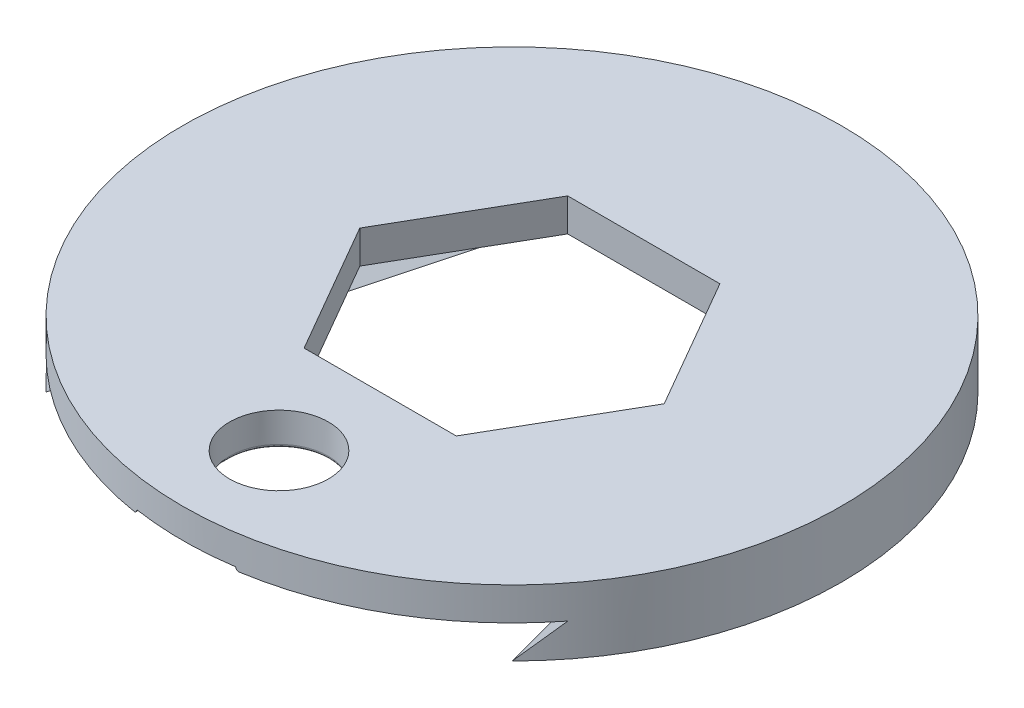
ISO-10303-21;
HEADER;
FILE_DESCRIPTION(('STEP AP214'),'2;1');
FILE_NAME('part.step','',(''),(''),'','','');
FILE_SCHEMA(('AUTOMOTIVE_DESIGN { 1 0 10303 214 1 1 1 1 }'));
ENDSEC;
DATA;
#1=APPLICATION_CONTEXT('core data for automotive mechanical design processes');
#2=APPLICATION_PROTOCOL_DEFINITION('international standard','automotive_design',2000,#1);
#3=PRODUCT_CONTEXT('',#1,'mechanical');
#4=PRODUCT('Part','Part','',(#3));
#5=PRODUCT_RELATED_PRODUCT_CATEGORY('part','',(#4));
#6=PRODUCT_DEFINITION_FORMATION('','',#4);
#7=PRODUCT_DEFINITION_CONTEXT('part definition',#1,'design');
#8=PRODUCT_DEFINITION('design','',#6,#7);
#9=PRODUCT_DEFINITION_SHAPE('','',#8);
#10=(LENGTH_UNIT() NAMED_UNIT(*) SI_UNIT(.MILLI.,.METRE.));
#11=(NAMED_UNIT(*) PLANE_ANGLE_UNIT() SI_UNIT($,.RADIAN.));
#12=(NAMED_UNIT(*) SI_UNIT($,.STERADIAN.) SOLID_ANGLE_UNIT());
#13=UNCERTAINTY_MEASURE_WITH_UNIT(LENGTH_MEASURE(1.E-05),#10,'distance_accuracy_value','');
#14=(GEOMETRIC_REPRESENTATION_CONTEXT(3) GLOBAL_UNCERTAINTY_ASSIGNED_CONTEXT((#13)) GLOBAL_UNIT_ASSIGNED_CONTEXT((#10,
#11,#12)) REPRESENTATION_CONTEXT('',''));
#15=CARTESIAN_POINT('',(0.,0.,0.));
#16=DIRECTION('',(0.,0.,1.));
#17=DIRECTION('',(1.,0.,0.));
#18=AXIS2_PLACEMENT_3D('',#15,#16,#17);
#19=CARTESIAN_POINT('',(0.,0.,0.));
#20=DIRECTION('',(0.,1.,0.));
#21=DIRECTION('',(0.,0.,1.));
#22=AXIS2_PLACEMENT_3D('',#19,#20,#21);
#23=PLANE('',#22);
#24=DIRECTION('',(-0.5,0.,0.866025403784439));
#25=VECTOR('',#24,1.);
#26=CARTESIAN_POINT('',(23.094010767585,0.,0.));
#27=LINE('',#26,#25);
#28=CARTESIAN_POINT('',(23.094010767585,0.,0.));
#29=VERTEX_POINT('',#28);
#30=CARTESIAN_POINT('',(11.5470053837925,0.,20.));
#31=VERTEX_POINT('',#30);
#32=EDGE_CURVE('E226',#29,#31,#27,.T.);
#33=ORIENTED_EDGE('',*,*,#32,.F.);
#34=DIRECTION('',(0.5,0.,0.866025403784439));
#35=VECTOR('',#34,1.);
#36=CARTESIAN_POINT('',(11.5470053837925,0.,-20.));
#37=LINE('',#36,#35);
#38=CARTESIAN_POINT('',(11.5470053837925,0.,-20.));
#39=VERTEX_POINT('',#38);
#40=EDGE_CURVE('E327',#39,#29,#37,.T.);
#41=ORIENTED_EDGE('',*,*,#40,.F.);
#42=DIRECTION('',(1.,0.,0.));
#43=VECTOR('',#42,1.);
#44=CARTESIAN_POINT('',(-11.5470053837925,0.,-20.));
#45=LINE('',#44,#43);
#46=CARTESIAN_POINT('',(-11.5470053837925,0.,-20.));
#47=VERTEX_POINT('',#46);
#48=EDGE_CURVE('E308',#47,#39,#45,.T.);
#49=ORIENTED_EDGE('',*,*,#48,.F.);
#50=DIRECTION('',(0.5,0.,-0.866025403784439));
#51=VECTOR('',#50,1.);
#52=CARTESIAN_POINT('',(-23.094010767585,0.,0.));
#53=LINE('',#52,#51);
#54=CARTESIAN_POINT('',(-23.094010767585,0.,0.));
#55=VERTEX_POINT('',#54);
#56=EDGE_CURVE('E313',#55,#47,#53,.T.);
#57=ORIENTED_EDGE('',*,*,#56,.F.);
#58=DIRECTION('',(-0.5,0.,-0.866025403784439));
#59=VECTOR('',#58,1.);
#60=CARTESIAN_POINT('',(-11.5470053837925,0.,20.));
#61=LINE('',#60,#59);
#62=CARTESIAN_POINT('',(-11.5470053837925,0.,20.));
#63=VERTEX_POINT('',#62);
#64=EDGE_CURVE('E317',#63,#55,#61,.T.);
#65=ORIENTED_EDGE('',*,*,#64,.F.);
#66=DIRECTION('',(-1.,0.,0.));
#67=VECTOR('',#66,1.);
#68=CARTESIAN_POINT('',(11.5470053837925,0.,20.));
#69=LINE('',#68,#67);
#70=EDGE_CURVE('E321',#31,#63,#69,.T.);
#71=ORIENTED_EDGE('',*,*,#70,.F.);
#72=EDGE_LOOP('',(#33,#41,#49,#57,#65,#71));
#73=FACE_BOUND('',#72,.T.);
#74=CARTESIAN_POINT('',(0.,0.,35.3553390593274));
#75=DIRECTION('',(0.,1.,0.));
#76=DIRECTION('',(0.,0.,1.));
#77=AXIS2_PLACEMENT_3D('',#74,#75,#76);
#78=CIRCLE('',#77,8.);
#79=CARTESIAN_POINT('',(7.99999999999999,0.,35.3553390593274));
#80=VERTEX_POINT('',#79);
#81=CARTESIAN_POINT('',(-8.00000000000001,0.,35.3553390593274));
#82=VERTEX_POINT('',#81);
#83=EDGE_CURVE('E176',#80,#82,#78,.T.);
#84=ORIENTED_EDGE('',*,*,#83,.T.);
#85=DIRECTION('',(0.,0.,1.));
#86=VECTOR('',#85,1.);
#87=CARTESIAN_POINT('',(-8.00000000000001,0.,49.434299833213));
#88=LINE('',#87,#86);
#89=CARTESIAN_POINT('',(-8.00000000000001,0.,49.3558507170123));
#90=VERTEX_POINT('',#89);
#91=EDGE_CURVE('E158',#82,#90,#88,.T.);
#92=ORIENTED_EDGE('',*,*,#91,.T.);
#93=CARTESIAN_POINT('',(0.,0.,0.));
#94=DIRECTION('',(0.,1.,0.));
#95=DIRECTION('',(0.,0.,1.));
#96=AXIS2_PLACEMENT_3D('',#93,#94,#95);
#97=CIRCLE('',#96,50.);
#98=CARTESIAN_POINT('',(-39.3305365927729,0.,30.8724616984871));
#99=VERTEX_POINT('',#98);
#100=EDGE_CURVE('E275',#99,#90,#97,.T.);
#101=ORIENTED_EDGE('',*,*,#100,.F.);
#102=DIRECTION('',(0.258819045102514,0.,-0.96592582628907));
#103=VECTOR('',#102,1.);
#104=CARTESIAN_POINT('',(-28.9777747886724,0.,-7.76457135307551));
#105=LINE('',#104,#103);
#106=CARTESIAN_POINT('',(-18.6250129845719,0.,-46.4016044046381));
#107=VERTEX_POINT('',#106);
#108=EDGE_CURVE('E248',#99,#107,#105,.T.);
#109=ORIENTED_EDGE('',*,*,#108,.T.);
#110=CARTESIAN_POINT('',(18.6250129845719,0.,-46.4016044046381));
#111=VERTEX_POINT('',#110);
#112=EDGE_CURVE('E271',#111,#107,#97,.T.);
#113=ORIENTED_EDGE('',*,*,#112,.F.);
#114=DIRECTION('',(0.258819045102514,0.,0.96592582628907));
#115=VECTOR('',#114,1.);
#116=CARTESIAN_POINT('',(28.9777747886724,0.,-7.7645713530755));
#117=LINE('',#116,#115);
#118=CARTESIAN_POINT('',(39.3305365927729,0.,30.8724616984871));
#119=VERTEX_POINT('',#118);
#120=EDGE_CURVE('E241',#119,#111,#117,.F.);
#121=ORIENTED_EDGE('',*,*,#120,.F.);
#122=CARTESIAN_POINT('',(7.99999999999999,0.,49.3558507170123));
#123=VERTEX_POINT('',#122);
#124=EDGE_CURVE('E259',#123,#119,#97,.T.);
#125=ORIENTED_EDGE('',*,*,#124,.F.);
#126=DIRECTION('',(0.,0.,1.));
#127=VECTOR('',#126,1.);
#128=CARTESIAN_POINT('',(7.99999999999999,0.,0.));
#129=LINE('',#128,#127);
#130=EDGE_CURVE('E71',#123,#80,#129,.F.);
#131=ORIENTED_EDGE('',*,*,#130,.T.);
#132=EDGE_LOOP('',(#84,#92,#101,#109,#113,#121,#125,#131));
#133=FACE_BOUND('',#132,.T.);
#134=ADVANCED_FACE('F44',(#73,#133),#23,.F.);
#135=CARTESIAN_POINT('',(0.,5.,0.));
#136=DIRECTION('',(0.,-1.,0.));
#137=DIRECTION('',(0.,0.,-1.));
#138=AXIS2_PLACEMENT_3D('',#135,#136,#137);
#139=CYLINDRICAL_SURFACE('',#138,50.);
#140=CARTESIAN_POINT('',(0.,5.,0.));
#141=DIRECTION('',(0.,1.,0.));
#142=DIRECTION('',(0.,0.,1.));
#143=AXIS2_PLACEMENT_3D('',#140,#141,#142);
#144=CIRCLE('',#143,50.);
#145=CARTESIAN_POINT('',(0.,5.,50.));
#146=VERTEX_POINT('',#145);
#147=EDGE_CURVE('E234',#146,#146,#144,.T.);
#148=ORIENTED_EDGE('',*,*,#147,.F.);
#149=EDGE_LOOP('',(#148));
#150=FACE_BOUND('',#149,.T.);
#151=ORIENTED_EDGE('',*,*,#100,.T.);
#152=CARTESIAN_POINT('',(-8.00000000000001,0.,49.3558507170123));
#153=CARTESIAN_POINT('',(-7.97163322853054,-2.2813006352835E-05,49.3604496042738));
#154=CARTESIAN_POINT('',(-7.94326652201785,0.00241275853359065,49.3650214720399));
#155=CARTESIAN_POINT('',(-7.88733401466159,0.012039765860883,49.3739884818323));
#156=CARTESIAN_POINT('',(-7.85976791130427,0.0192293802348624,49.3783836908579));
#157=CARTESIAN_POINT('',(-7.80619731253424,0.0382098680578775,49.386881122311));
#158=CARTESIAN_POINT('',(-7.78019382802344,0.0500036838905113,49.3909831553927));
#159=CARTESIAN_POINT('',(-7.73053037341646,0.0778672010649352,49.398780660258));
#160=CARTESIAN_POINT('',(-7.70686971091626,0.0939356338678293,49.4024762521983));
#161=CARTESIAN_POINT('',(-7.66273061398303,0.129793613139355,49.4093417953124));
#162=CARTESIAN_POINT('',(-7.64223251174142,0.149558316732205,49.4125150041863));
#163=CARTESIAN_POINT('',(-7.6048459999932,0.19233133352452,49.41828281136));
#164=CARTESIAN_POINT('',(-7.58795821857121,0.215340209956571,49.4208773089853));
#165=CARTESIAN_POINT('',(-7.55848593733529,0.263658333989822,49.425393381622));
#166=CARTESIAN_POINT('',(-7.54585439673199,0.28893823863591,49.4273223186712));
#167=CARTESIAN_POINT('',(-7.52502179598288,0.34129297873107,49.4304982662358));
#168=CARTESIAN_POINT('',(-7.51681740453433,0.368366447302166,49.4317457895043));
#169=CARTESIAN_POINT('',(-7.50731080368694,0.413029641977492,49.4331902445579));
#170=CARTESIAN_POINT('',(-7.50457083020848,0.430319574629775,49.4336062048164));
#171=CARTESIAN_POINT('',(-7.50091585144748,0.465070389910559,49.4341608857263));
#172=CARTESIAN_POINT('',(-7.49999822073546,0.482530990135125,49.4343000052198));
#173=CARTESIAN_POINT('',(-7.50000000000001,0.5,49.434299833213));
#174=B_SPLINE_CURVE_WITH_KNOTS('',3,(#152,#153,#154,#155,#156,#157,#158,#159,#160,#161,#162,
#163,#164,#165,#166,#167,#168,#169,#170,#171,#172,#173),.UNSPECIFIED.,.F.,.F.,(4,2,2,2,2,2,2,2,
2,2,4),(0.,0.0861025330638387,0.172172096818719,0.258296754890621,0.344395882993472,
0.429935876235521,0.515490738713732,0.600066385849996,0.684578303176507,0.737019887929499,
0.789385865690965),.UNSPECIFIED.);
#175=CARTESIAN_POINT('',(-7.50000000000001,0.5,49.434299833213));
#176=VERTEX_POINT('',#175);
#177=EDGE_CURVE('E11',#90,#176,#174,.T.);
#178=ORIENTED_EDGE('',*,*,#177,.T.);
#179=CARTESIAN_POINT('',(0.,0.5,0.));
#180=DIRECTION('',(0.,-1.,0.));
#181=DIRECTION('',(0.,0.,-1.));
#182=AXIS2_PLACEMENT_3D('',#179,#180,#181);
#183=CIRCLE('',#182,50.);
#184=CARTESIAN_POINT('',(7.49999999999999,0.5,49.434299833213));
#185=VERTEX_POINT('',#184);
#186=EDGE_CURVE('E173',#185,#176,#183,.T.);
#187=ORIENTED_EDGE('',*,*,#186,.F.);
#188=CARTESIAN_POINT('',(7.49999999999999,0.5,49.434299833213));
#189=CARTESIAN_POINT('',(7.49997504930824,0.47210584121759,49.4343029460756));
#190=CARTESIAN_POINT('',(7.50233270766687,0.444220590805083,49.4339459130125));
#191=CARTESIAN_POINT('',(7.51162706046058,0.389272121293195,49.4325348181089));
#192=CARTESIAN_POINT('',(7.51855874478479,0.362208036626926,49.4314815189139));
#193=CARTESIAN_POINT('',(7.53681914448417,0.309631835688784,49.4287005394214));
#194=CARTESIAN_POINT('',(7.54814951326338,0.284120307177176,49.4269726055369));
#195=CARTESIAN_POINT('',(7.57485911450709,0.235373570989183,49.4228863223366));
#196=CARTESIAN_POINT('',(7.59023797906786,0.212138156735919,49.4205280303037));
#197=CARTESIAN_POINT('',(7.62467710800145,0.168473678833202,49.4152264257029));
#198=CARTESIAN_POINT('',(7.64375450848494,0.148058466556115,49.4122803880616));
#199=CARTESIAN_POINT('',(7.684992799281,0.110712943069613,49.4058834583408));
#200=CARTESIAN_POINT('',(7.70715433526991,0.0937833634365427,49.4024324605379));
#201=CARTESIAN_POINT('',(7.75418313950998,0.0636949561980241,49.3950727890579));
#202=CARTESIAN_POINT('',(7.7790774134561,0.0505795138035247,49.3911595115642));
#203=CARTESIAN_POINT('',(7.83066080652012,0.0287165470206756,49.3830075196335));
#204=CARTESIAN_POINT('',(7.85734920136713,0.019967271921735,49.3787689364228));
#205=CARTESIAN_POINT('',(7.90347080230844,0.00902046953665198,49.3714038368539));
#206=CARTESIAN_POINT('',(7.92264063836458,0.00563943978062809,49.3683313753879));
#207=CARTESIAN_POINT('',(7.96120529346963,0.00112935274449694,49.3621271386992));
#208=CARTESIAN_POINT('',(7.98059974979532,-2.93233765227581E-06,49.3589954550152));
#209=CARTESIAN_POINT('',(7.99999999999999,0.,49.3558507170123));
#210=B_SPLINE_CURVE_WITH_KNOTS('',3,(#188,#189,#190,#191,#192,#193,#194,#195,#196,#197,#198,
#199,#200,#201,#202,#203,#204,#205,#206,#207,#208,#209),.UNSPECIFIED.,.F.,.F.,(4,2,2,2,2,2,2,2,
2,2,4),(0.,0.0835676351596099,0.167043886999746,0.250551546825049,0.334051620578838,
0.417948235769859,0.501862441555882,0.586696836520137,0.671497187885039,0.730494501085943,
0.789407069370825),.UNSPECIFIED.);
#211=EDGE_CURVE('E55',#185,#123,#210,.T.);
#212=ORIENTED_EDGE('',*,*,#211,.T.);
#213=ORIENTED_EDGE('',*,*,#124,.T.);
#214=CARTESIAN_POINT('',(0.,-30.0000000000002,0.));
#215=DIRECTION('',(-0.683012701892219,0.707106781186549,0.183012701892214));
#216=DIRECTION('',(-0.683012701892222,-0.707106781186546,0.183012701892215));
#217=AXIS2_PLACEMENT_3D('',#214,#215,#216);
#218=ELLIPSE('',#217,70.7106781186546,50.);
#219=CARTESIAN_POINT('',(35.3553390593274,-5.,35.3553390593274));
#220=VERTEX_POINT('',#219);
#221=EDGE_CURVE('E260',#220,#119,#218,.T.);
#222=ORIENTED_EDGE('',*,*,#221,.F.);
#223=CARTESIAN_POINT('',(0.,-5.,0.));
#224=DIRECTION('',(0.,1.,0.));
#225=DIRECTION('',(0.,0.,1.));
#226=AXIS2_PLACEMENT_3D('',#223,#224,#225);
#227=CIRCLE('',#226,50.);
#228=CARTESIAN_POINT('',(12.9409522551267,-5.,-48.2962913144532));
#229=VERTEX_POINT('',#228);
#230=EDGE_CURVE('E264',#220,#229,#227,.T.);
#231=ORIENTED_EDGE('',*,*,#230,.T.);
#232=CARTESIAN_POINT('',(0.,-30.0000000000002,0.));
#233=DIRECTION('',(-0.683012701892219,0.707106781186549,0.183012701892214));
#234=DIRECTION('',(-0.683012701892222,-0.707106781186546,0.183012701892215));
#235=AXIS2_PLACEMENT_3D('',#232,#233,#234);
#236=ELLIPSE('',#235,70.7106781186546,50.);
#237=EDGE_CURVE('E255',#229,#111,#236,.F.);
#238=ORIENTED_EDGE('',*,*,#237,.T.);
#239=ORIENTED_EDGE('',*,*,#112,.T.);
#240=CARTESIAN_POINT('',(0.,-30.0000000000002,0.));
#241=DIRECTION('',(0.683012701892219,0.707106781186549,0.183012701892214));
#242=DIRECTION('',(0.683012701892222,-0.707106781186546,0.183012701892215));
#243=AXIS2_PLACEMENT_3D('',#240,#241,#242);
#244=ELLIPSE('',#243,70.7106781186546,50.);
#245=CARTESIAN_POINT('',(-12.9409522551267,-5.,-48.2962913144532));
#246=VERTEX_POINT('',#245);
#247=EDGE_CURVE('E242',#246,#107,#244,.T.);
#248=ORIENTED_EDGE('',*,*,#247,.F.);
#249=CARTESIAN_POINT('',(0.,-5.,0.));
#250=DIRECTION('',(0.,1.,0.));
#251=DIRECTION('',(0.,0.,1.));
#252=AXIS2_PLACEMENT_3D('',#249,#250,#251);
#253=CIRCLE('',#252,50.);
#254=CARTESIAN_POINT('',(-35.3553390593274,-5.,35.3553390593274));
#255=VERTEX_POINT('',#254);
#256=EDGE_CURVE('E247',#246,#255,#253,.T.);
#257=ORIENTED_EDGE('',*,*,#256,.T.);
#258=CARTESIAN_POINT('',(0.,-30.0000000000002,0.));
#259=DIRECTION('',(0.683012701892219,0.707106781186549,0.183012701892214));
#260=DIRECTION('',(0.683012701892222,-0.707106781186546,0.183012701892215));
#261=AXIS2_PLACEMENT_3D('',#258,#259,#260);
#262=ELLIPSE('',#261,70.7106781186546,50.);
#263=EDGE_CURVE('E237',#255,#99,#262,.F.);
#264=ORIENTED_EDGE('',*,*,#263,.T.);
#265=EDGE_LOOP('',(#151,#178,#187,#212,#213,#222,#231,#238,#239,#248,#257,#264));
#266=FACE_BOUND('',#265,.T.);
#267=ADVANCED_FACE('F194',(#150,#266),#139,.T.);
#268=CARTESIAN_POINT('',(0.,5.,0.));
#269=DIRECTION('',(0.,1.,0.));
#270=DIRECTION('',(0.,0.,1.));
#271=AXIS2_PLACEMENT_3D('',#268,#269,#270);
#272=PLANE('',#271);
#273=DIRECTION('',(0.5,0.,0.866025403784439));
#274=VECTOR('',#273,1.);
#275=CARTESIAN_POINT('',(11.5470053837925,5.,-20.));
#276=LINE('',#275,#274);
#277=CARTESIAN_POINT('',(11.5470053837925,5.,-20.));
#278=VERTEX_POINT('',#277);
#279=CARTESIAN_POINT('',(23.094010767585,5.,0.));
#280=VERTEX_POINT('',#279);
#281=EDGE_CURVE('E312',#278,#280,#276,.T.);
#282=ORIENTED_EDGE('',*,*,#281,.T.);
#283=DIRECTION('',(-0.5,0.,0.866025403784439));
#284=VECTOR('',#283,1.);
#285=CARTESIAN_POINT('',(23.094010767585,5.,0.));
#286=LINE('',#285,#284);
#287=CARTESIAN_POINT('',(11.5470053837925,5.,20.));
#288=VERTEX_POINT('',#287);
#289=EDGE_CURVE('E345',#280,#288,#286,.T.);
#290=ORIENTED_EDGE('',*,*,#289,.T.);
#291=DIRECTION('',(-1.,0.,0.));
#292=VECTOR('',#291,1.);
#293=CARTESIAN_POINT('',(11.5470053837925,5.,20.));
#294=LINE('',#293,#292);
#295=CARTESIAN_POINT('',(-11.5470053837925,5.,20.));
#296=VERTEX_POINT('',#295);
#297=EDGE_CURVE('E341',#288,#296,#294,.T.);
#298=ORIENTED_EDGE('',*,*,#297,.T.);
#299=DIRECTION('',(-0.5,0.,-0.866025403784439));
#300=VECTOR('',#299,1.);
#301=CARTESIAN_POINT('',(-11.5470053837925,5.,20.));
#302=LINE('',#301,#300);
#303=CARTESIAN_POINT('',(-23.094010767585,5.,0.));
#304=VERTEX_POINT('',#303);
#305=EDGE_CURVE('E337',#296,#304,#302,.T.);
#306=ORIENTED_EDGE('',*,*,#305,.T.);
#307=DIRECTION('',(0.5,0.,-0.866025403784439));
#308=VECTOR('',#307,1.);
#309=CARTESIAN_POINT('',(-23.094010767585,5.,0.));
#310=LINE('',#309,#308);
#311=CARTESIAN_POINT('',(-11.5470053837925,5.,-20.));
#312=VERTEX_POINT('',#311);
#313=EDGE_CURVE('E333',#304,#312,#310,.T.);
#314=ORIENTED_EDGE('',*,*,#313,.T.);
#315=DIRECTION('',(1.,0.,0.));
#316=VECTOR('',#315,1.);
#317=CARTESIAN_POINT('',(-11.5470053837925,5.,-20.));
#318=LINE('',#317,#316);
#319=EDGE_CURVE('E294',#312,#278,#318,.T.);
#320=ORIENTED_EDGE('',*,*,#319,.T.);
#321=EDGE_LOOP('',(#282,#290,#298,#306,#314,#320));
#322=FACE_BOUND('',#321,.T.);
#323=CARTESIAN_POINT('',(0.,5.,35.3553390593274));
#324=DIRECTION('',(0.,1.,0.));
#325=DIRECTION('',(0.,0.,1.));
#326=AXIS2_PLACEMENT_3D('',#323,#324,#325);
#327=CIRCLE('',#326,7.5);
#328=CARTESIAN_POINT('',(0.,5.,42.8553390593274));
#329=VERTEX_POINT('',#328);
#330=EDGE_CURVE('E254',#329,#329,#327,.T.);
#331=ORIENTED_EDGE('',*,*,#330,.F.);
#332=EDGE_LOOP('',(#331));
#333=FACE_BOUND('',#332,.T.);
#334=ORIENTED_EDGE('',*,*,#147,.T.);
#335=EDGE_LOOP('',(#334));
#336=FACE_BOUND('',#335,.T.);
#337=ADVANCED_FACE('F199',(#322,#333,#336),#272,.T.);
#338=CARTESIAN_POINT('',(24.148145657227,-5.,-6.47047612756293));
#339=DIRECTION('',(-0.683012701892219,0.707106781186549,0.183012701892214));
#340=DIRECTION('',(-0.719254596676404,-0.694746590606865,0.));
#341=AXIS2_PLACEMENT_3D('',#338,#339,#340);
#342=PLANE('',#341);
#343=ORIENTED_EDGE('',*,*,#120,.T.);
#344=ORIENTED_EDGE('',*,*,#237,.F.);
#345=DIRECTION('',(0.258819045102514,0.,0.96592582628907));
#346=VECTOR('',#345,1.);
#347=CARTESIAN_POINT('',(24.148145657227,-5.,-6.47047612756293));
#348=LINE('',#347,#346);
#349=EDGE_CURVE('E261',#220,#229,#348,.F.);
#350=ORIENTED_EDGE('',*,*,#349,.F.);
#351=ORIENTED_EDGE('',*,*,#221,.T.);
#352=EDGE_LOOP('',(#343,#344,#350,#351));
#353=FACE_BOUND('',#352,.T.);
#354=ADVANCED_FACE('F202',(#353),#342,.T.);
#355=CARTESIAN_POINT('',(0.,-5.,0.));
#356=DIRECTION('',(0.,1.,0.));
#357=DIRECTION('',(0.,0.,1.));
#358=AXIS2_PLACEMENT_3D('',#355,#356,#357);
#359=PLANE('',#358);
#360=ORIENTED_EDGE('',*,*,#349,.T.);
#361=ORIENTED_EDGE('',*,*,#230,.F.);
#362=EDGE_LOOP('',(#360,#361));
#363=FACE_BOUND('',#362,.T.);
#364=ADVANCED_FACE('F206',(#363),#359,.F.);
#365=CARTESIAN_POINT('',(-24.148145657227,-5.,-6.47047612756293));
#366=DIRECTION('',(0.683012701892219,0.707106781186549,0.183012701892214));
#367=DIRECTION('',(-0.719254596676404,0.694746590606865,0.));
#368=AXIS2_PLACEMENT_3D('',#365,#366,#367);
#369=PLANE('',#368);
#370=ORIENTED_EDGE('',*,*,#108,.F.);
#371=ORIENTED_EDGE('',*,*,#263,.F.);
#372=DIRECTION('',(0.258819045102514,0.,-0.96592582628907));
#373=VECTOR('',#372,1.);
#374=CARTESIAN_POINT('',(-24.148145657227,-5.,-6.47047612756293));
#375=LINE('',#374,#373);
#376=EDGE_CURVE('E243',#255,#246,#375,.T.);
#377=ORIENTED_EDGE('',*,*,#376,.T.);
#378=ORIENTED_EDGE('',*,*,#247,.T.);
#379=EDGE_LOOP('',(#370,#371,#377,#378));
#380=FACE_BOUND('',#379,.T.);
#381=ADVANCED_FACE('F208',(#380),#369,.T.);
#382=CARTESIAN_POINT('',(0.,-5.,0.));
#383=DIRECTION('',(0.,1.,0.));
#384=DIRECTION('',(0.,0.,1.));
#385=AXIS2_PLACEMENT_3D('',#382,#383,#384);
#386=PLANE('',#385);
#387=ORIENTED_EDGE('',*,*,#376,.F.);
#388=ORIENTED_EDGE('',*,*,#256,.F.);
#389=EDGE_LOOP('',(#387,#388));
#390=FACE_BOUND('',#389,.T.);
#391=ADVANCED_FACE('F210',(#390),#386,.F.);
#392=CARTESIAN_POINT('',(0.,-5.,35.3553390593274));
#393=DIRECTION('',(0.,1.,0.));
#394=DIRECTION('',(0.,0.,1.));
#395=AXIS2_PLACEMENT_3D('',#392,#393,#394);
#396=CYLINDRICAL_SURFACE('',#395,7.5);
#397=CARTESIAN_POINT('',(0.,0.5,35.3553390593274));
#398=DIRECTION('',(0.,-1.,0.));
#399=DIRECTION('',(0.,0.,-1.));
#400=AXIS2_PLACEMENT_3D('',#397,#398,#399);
#401=CIRCLE('',#400,7.5);
#402=CARTESIAN_POINT('',(-7.50000000000001,0.5,35.3553390593274));
#403=VERTEX_POINT('',#402);
#404=CARTESIAN_POINT('',(7.49999999999999,0.5,35.3553390593274));
#405=VERTEX_POINT('',#404);
#406=EDGE_CURVE('E155',#403,#405,#401,.F.);
#407=ORIENTED_EDGE('',*,*,#406,.F.);
#408=CARTESIAN_POINT('',(0.,0.5,35.3553390593274));
#409=DIRECTION('',(0.,1.,0.));
#410=DIRECTION('',(0.,0.,1.));
#411=AXIS2_PLACEMENT_3D('',#408,#409,#410);
#412=CIRCLE('',#411,7.5);
#413=EDGE_CURVE('E151',#403,#405,#412,.F.);
#414=ORIENTED_EDGE('',*,*,#413,.T.);
#415=EDGE_LOOP('',(#407,#414));
#416=FACE_BOUND('',#415,.T.);
#417=ORIENTED_EDGE('',*,*,#330,.T.);
#418=EDGE_LOOP('',(#417));
#419=FACE_BOUND('',#418,.T.);
#420=ADVANCED_FACE('F153',(#416,#419),#396,.F.);
#421=CARTESIAN_POINT('',(11.5470053837925,5.,-20.));
#422=DIRECTION('',(0.866025403784439,0.,-0.5));
#423=DIRECTION('',(-0.5,0.,-0.866025403784439));
#424=AXIS2_PLACEMENT_3D('',#421,#422,#423);
#425=PLANE('',#424);
#426=ORIENTED_EDGE('',*,*,#40,.T.);
#427=DIRECTION('',(0.,-1.,0.));
#428=VECTOR('',#427,1.);
#429=CARTESIAN_POINT('',(23.094010767585,5.,0.));
#430=LINE('',#429,#428);
#431=EDGE_CURVE('E289',#280,#29,#430,.T.);
#432=ORIENTED_EDGE('',*,*,#431,.F.);
#433=ORIENTED_EDGE('',*,*,#281,.F.);
#434=DIRECTION('',(0.,-1.,0.));
#435=VECTOR('',#434,1.);
#436=CARTESIAN_POINT('',(11.5470053837925,5.,-20.));
#437=LINE('',#436,#435);
#438=EDGE_CURVE('E288',#278,#39,#437,.T.);
#439=ORIENTED_EDGE('',*,*,#438,.T.);
#440=EDGE_LOOP('',(#426,#432,#433,#439));
#441=FACE_BOUND('',#440,.T.);
#442=ADVANCED_FACE('F371',(#441),#425,.F.);
#443=CARTESIAN_POINT('',(-11.5470053837925,5.,-20.));
#444=DIRECTION('',(0.,0.,-1.));
#445=DIRECTION('',(-1.,0.,0.));
#446=AXIS2_PLACEMENT_3D('',#443,#444,#445);
#447=PLANE('',#446);
#448=ORIENTED_EDGE('',*,*,#48,.T.);
#449=ORIENTED_EDGE('',*,*,#438,.F.);
#450=ORIENTED_EDGE('',*,*,#319,.F.);
#451=DIRECTION('',(0.,-1.,0.));
#452=VECTOR('',#451,1.);
#453=CARTESIAN_POINT('',(-11.5470053837925,5.,-20.));
#454=LINE('',#453,#452);
#455=EDGE_CURVE('E303',#312,#47,#454,.T.);
#456=ORIENTED_EDGE('',*,*,#455,.T.);
#457=EDGE_LOOP('',(#448,#449,#450,#456));
#458=FACE_BOUND('',#457,.T.);
#459=ADVANCED_FACE('F403',(#458),#447,.F.);
#460=CARTESIAN_POINT('',(-23.094010767585,5.,0.));
#461=DIRECTION('',(-0.866025403784439,0.,-0.5));
#462=DIRECTION('',(-0.5,0.,0.866025403784439));
#463=AXIS2_PLACEMENT_3D('',#460,#461,#462);
#464=PLANE('',#463);
#465=ORIENTED_EDGE('',*,*,#56,.T.);
#466=ORIENTED_EDGE('',*,*,#455,.F.);
#467=ORIENTED_EDGE('',*,*,#313,.F.);
#468=DIRECTION('',(0.,-1.,0.));
#469=VECTOR('',#468,1.);
#470=CARTESIAN_POINT('',(-23.094010767585,5.,0.));
#471=LINE('',#470,#469);
#472=EDGE_CURVE('E300',#304,#55,#471,.T.);
#473=ORIENTED_EDGE('',*,*,#472,.T.);
#474=EDGE_LOOP('',(#465,#466,#467,#473));
#475=FACE_BOUND('',#474,.T.);
#476=ADVANCED_FACE('F400',(#475),#464,.F.);
#477=CARTESIAN_POINT('',(-11.5470053837925,5.,20.));
#478=DIRECTION('',(-0.866025403784439,0.,0.5));
#479=DIRECTION('',(0.5,0.,0.866025403784439));
#480=AXIS2_PLACEMENT_3D('',#477,#478,#479);
#481=PLANE('',#480);
#482=ORIENTED_EDGE('',*,*,#64,.T.);
#483=ORIENTED_EDGE('',*,*,#472,.F.);
#484=ORIENTED_EDGE('',*,*,#305,.F.);
#485=DIRECTION('',(0.,-1.,0.));
#486=VECTOR('',#485,1.);
#487=CARTESIAN_POINT('',(-11.5470053837925,5.,20.));
#488=LINE('',#487,#486);
#489=EDGE_CURVE('E297',#296,#63,#488,.T.);
#490=ORIENTED_EDGE('',*,*,#489,.T.);
#491=EDGE_LOOP('',(#482,#483,#484,#490));
#492=FACE_BOUND('',#491,.T.);
#493=ADVANCED_FACE('F397',(#492),#481,.F.);
#494=CARTESIAN_POINT('',(11.5470053837925,5.,20.));
#495=DIRECTION('',(0.,0.,1.));
#496=DIRECTION('',(1.,0.,0.));
#497=AXIS2_PLACEMENT_3D('',#494,#495,#496);
#498=PLANE('',#497);
#499=ORIENTED_EDGE('',*,*,#70,.T.);
#500=ORIENTED_EDGE('',*,*,#489,.F.);
#501=ORIENTED_EDGE('',*,*,#297,.F.);
#502=DIRECTION('',(0.,-1.,0.));
#503=VECTOR('',#502,1.);
#504=CARTESIAN_POINT('',(11.5470053837925,5.,20.));
#505=LINE('',#504,#503);
#506=EDGE_CURVE('E293',#288,#31,#505,.T.);
#507=ORIENTED_EDGE('',*,*,#506,.T.);
#508=EDGE_LOOP('',(#499,#500,#501,#507));
#509=FACE_BOUND('',#508,.T.);
#510=ADVANCED_FACE('F392',(#509),#498,.F.);
#511=CARTESIAN_POINT('',(23.094010767585,5.,0.));
#512=DIRECTION('',(0.866025403784439,0.,0.5));
#513=DIRECTION('',(0.5,0.,-0.866025403784439));
#514=AXIS2_PLACEMENT_3D('',#511,#512,#513);
#515=PLANE('',#514);
#516=ORIENTED_EDGE('',*,*,#32,.T.);
#517=ORIENTED_EDGE('',*,*,#506,.F.);
#518=ORIENTED_EDGE('',*,*,#289,.F.);
#519=ORIENTED_EDGE('',*,*,#431,.T.);
#520=EDGE_LOOP('',(#516,#517,#518,#519));
#521=FACE_BOUND('',#520,.T.);
#522=ADVANCED_FACE('F390',(#521),#515,.F.);
#523=CARTESIAN_POINT('',(0.,0.5,0.));
#524=DIRECTION('',(0.,-1.,0.));
#525=DIRECTION('',(0.,0.,-1.));
#526=AXIS2_PLACEMENT_3D('',#523,#524,#525);
#527=PLANE('',#526);
#528=DIRECTION('',(0.,0.,1.));
#529=VECTOR('',#528,1.);
#530=CARTESIAN_POINT('',(-7.50000000000001,0.5,0.));
#531=LINE('',#530,#529);
#532=EDGE_CURVE('E167',#403,#176,#531,.T.);
#533=ORIENTED_EDGE('',*,*,#532,.F.);
#534=ORIENTED_EDGE('',*,*,#406,.T.);
#535=DIRECTION('',(0.,0.,1.));
#536=VECTOR('',#535,1.);
#537=CARTESIAN_POINT('',(7.49999999999999,0.5,0.));
#538=LINE('',#537,#536);
#539=EDGE_CURVE('E164',#405,#185,#538,.T.);
#540=ORIENTED_EDGE('',*,*,#539,.T.);
#541=ORIENTED_EDGE('',*,*,#186,.T.);
#542=EDGE_LOOP('',(#533,#534,#540,#541));
#543=FACE_BOUND('',#542,.T.);
#544=ADVANCED_FACE('F162',(#543),#527,.T.);
#545=CARTESIAN_POINT('',(7.99999999999999,0.5,0.));
#546=DIRECTION('',(0.,0.,1.));
#547=DIRECTION('',(1.,0.,0.));
#548=AXIS2_PLACEMENT_3D('',#545,#546,#547);
#549=CYLINDRICAL_SURFACE('',#548,0.5);
#550=ORIENTED_EDGE('',*,*,#211,.F.);
#551=ORIENTED_EDGE('',*,*,#539,.F.);
#552=CARTESIAN_POINT('',(7.99999999999999,0.5,35.3553390593274));
#553=DIRECTION('',(0.,0.,-1.));
#554=DIRECTION('',(-1.,0.,0.));
#555=AXIS2_PLACEMENT_3D('',#552,#553,#554);
#556=CIRCLE('',#555,0.5);
#557=EDGE_CURVE('E49',#80,#405,#556,.T.);
#558=ORIENTED_EDGE('',*,*,#557,.F.);
#559=ORIENTED_EDGE('',*,*,#130,.F.);
#560=EDGE_LOOP('',(#550,#551,#558,#559));
#561=FACE_BOUND('',#560,.T.);
#562=ADVANCED_FACE('F46',(#561),#549,.T.);
#563=CARTESIAN_POINT('',(-8.00000000000001,0.5,0.));
#564=DIRECTION('',(0.,0.,-1.));
#565=DIRECTION('',(-1.,0.,0.));
#566=AXIS2_PLACEMENT_3D('',#563,#564,#565);
#567=CYLINDRICAL_SURFACE('',#566,0.5);
#568=ORIENTED_EDGE('',*,*,#177,.F.);
#569=ORIENTED_EDGE('',*,*,#91,.F.);
#570=CARTESIAN_POINT('',(-8.00000000000001,0.5,35.3553390593274));
#571=DIRECTION('',(0.,0.,-1.));
#572=DIRECTION('',(-1.,0.,0.));
#573=AXIS2_PLACEMENT_3D('',#570,#571,#572);
#574=CIRCLE('',#573,0.5);
#575=EDGE_CURVE('E63',#403,#82,#574,.T.);
#576=ORIENTED_EDGE('',*,*,#575,.F.);
#577=ORIENTED_EDGE('',*,*,#532,.T.);
#578=EDGE_LOOP('',(#568,#569,#576,#577));
#579=FACE_BOUND('',#578,.T.);
#580=ADVANCED_FACE('F191',(#579),#567,.T.);
#581=CARTESIAN_POINT('',(0.,0.5,35.3553390593274));
#582=DIRECTION('',(0.,1.,0.));
#583=DIRECTION('',(0.,0.,1.));
#584=AXIS2_PLACEMENT_3D('',#581,#582,#583);
#585=TOROIDAL_SURFACE('',#584,8.,0.5);
#586=ORIENTED_EDGE('',*,*,#557,.T.);
#587=ORIENTED_EDGE('',*,*,#413,.F.);
#588=ORIENTED_EDGE('',*,*,#575,.T.);
#589=ORIENTED_EDGE('',*,*,#83,.F.);
#590=EDGE_LOOP('',(#586,#587,#588,#589));
#591=FACE_BOUND('',#590,.T.);
#592=ADVANCED_FACE('F175',(#591),#585,.T.);
#593=CLOSED_SHELL('',(#134,#267,#337,#354,#364,#381,#391,#420,#442,#459,#476,#493,#510,#522,
#544,#562,#580,#592));
#594=MANIFOLD_SOLID_BREP('B2',#593);
#595=ADVANCED_BREP_SHAPE_REPRESENTATION('',(#18,#594),#14);
#596=SHAPE_DEFINITION_REPRESENTATION(#9,#595);
ENDSEC;
END-ISO-10303-21;
